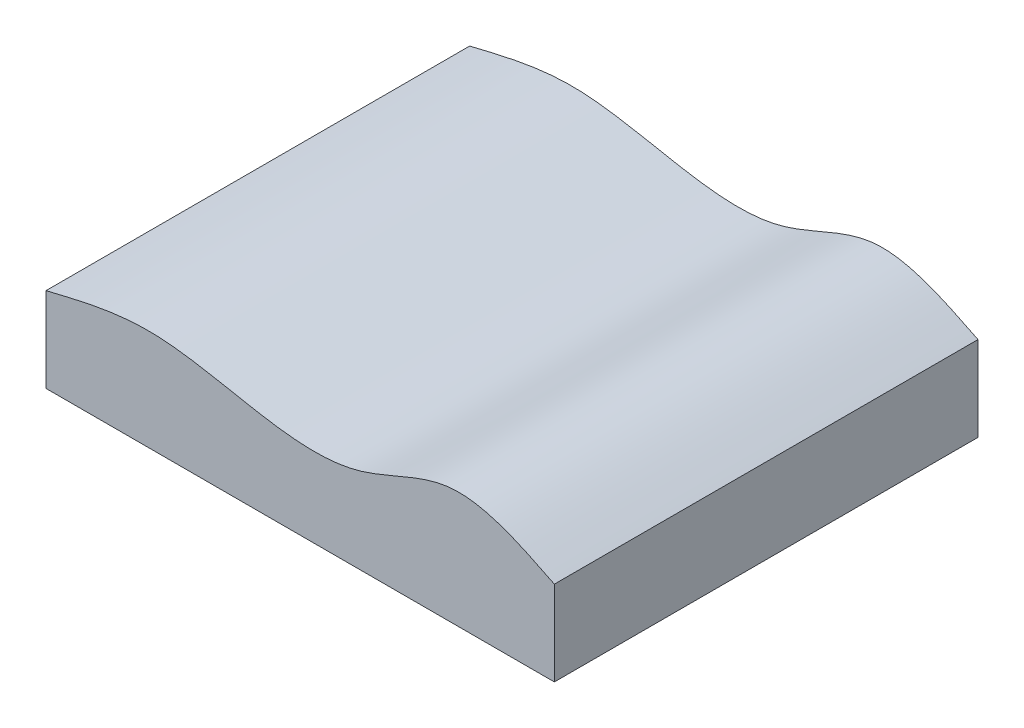
ISO-10303-21;
HEADER;
FILE_DESCRIPTION(('STEP AP214'),'2;1');
FILE_NAME('part.step','',(''),(''),'','','');
FILE_SCHEMA(('AUTOMOTIVE_DESIGN { 1 0 10303 214 1 1 1 1 }'));
ENDSEC;
DATA;
#1=APPLICATION_CONTEXT('core data for automotive mechanical design processes');
#2=APPLICATION_PROTOCOL_DEFINITION('international standard','automotive_design',2000,#1);
#3=PRODUCT_CONTEXT('',#1,'mechanical');
#4=PRODUCT('Part','Part','',(#3));
#5=PRODUCT_RELATED_PRODUCT_CATEGORY('part','',(#4));
#6=PRODUCT_DEFINITION_FORMATION('','',#4);
#7=PRODUCT_DEFINITION_CONTEXT('part definition',#1,'design');
#8=PRODUCT_DEFINITION('design','',#6,#7);
#9=PRODUCT_DEFINITION_SHAPE('','',#8);
#10=(LENGTH_UNIT() NAMED_UNIT(*) SI_UNIT(.MILLI.,.METRE.));
#11=(NAMED_UNIT(*) PLANE_ANGLE_UNIT() SI_UNIT($,.RADIAN.));
#12=(NAMED_UNIT(*) SI_UNIT($,.STERADIAN.) SOLID_ANGLE_UNIT());
#13=UNCERTAINTY_MEASURE_WITH_UNIT(LENGTH_MEASURE(1.E-05),#10,'distance_accuracy_value','');
#14=(GEOMETRIC_REPRESENTATION_CONTEXT(3) GLOBAL_UNCERTAINTY_ASSIGNED_CONTEXT((#13)) GLOBAL_UNIT_ASSIGNED_CONTEXT((#10,
#11,#12)) REPRESENTATION_CONTEXT('',''));
#15=CARTESIAN_POINT('',(0.,0.,0.));
#16=DIRECTION('',(0.,0.,1.));
#17=DIRECTION('',(1.,0.,0.));
#18=AXIS2_PLACEMENT_3D('',#15,#16,#17);
#19=CARTESIAN_POINT('',(0.,0.,127.));
#20=DIRECTION('',(1.,0.,0.));
#21=DIRECTION('',(0.,0.,-1.));
#22=AXIS2_PLACEMENT_3D('',#19,#20,#21);
#23=PLANE('',#22);
#24=DIRECTION('',(0.,-1.,0.));
#25=VECTOR('',#24,1.);
#26=CARTESIAN_POINT('',(0.,0.,0.));
#27=LINE('',#26,#25);
#28=CARTESIAN_POINT('',(0.,25.4,0.));
#29=VERTEX_POINT('',#28);
#30=CARTESIAN_POINT('',(0.,0.,0.));
#31=VERTEX_POINT('',#30);
#32=EDGE_CURVE('E102',#29,#31,#27,.T.);
#33=ORIENTED_EDGE('',*,*,#32,.T.);
#34=DIRECTION('',(0.,0.,-1.));
#35=VECTOR('',#34,1.);
#36=CARTESIAN_POINT('',(0.,0.,127.));
#37=LINE('',#36,#35);
#38=CARTESIAN_POINT('',(0.,0.,127.));
#39=VERTEX_POINT('',#38);
#40=EDGE_CURVE('E11',#39,#31,#37,.T.);
#41=ORIENTED_EDGE('',*,*,#40,.F.);
#42=DIRECTION('',(0.,-1.,0.));
#43=VECTOR('',#42,1.);
#44=CARTESIAN_POINT('',(0.,0.,127.));
#45=LINE('',#44,#43);
#46=CARTESIAN_POINT('',(0.,25.4,127.));
#47=VERTEX_POINT('',#46);
#48=EDGE_CURVE('E87',#47,#39,#45,.T.);
#49=ORIENTED_EDGE('',*,*,#48,.F.);
#50=DIRECTION('',(0.,0.,-1.));
#51=VECTOR('',#50,1.);
#52=CARTESIAN_POINT('',(0.,25.4,127.));
#53=LINE('',#52,#51);
#54=EDGE_CURVE('E95',#47,#29,#53,.T.);
#55=ORIENTED_EDGE('',*,*,#54,.T.);
#56=EDGE_LOOP('',(#33,#41,#49,#55));
#57=FACE_BOUND('',#56,.T.);
#58=ADVANCED_FACE('F36',(#57),#23,.F.);
#59=CARTESIAN_POINT('',(0.,0.,127.));
#60=DIRECTION('',(0.,1.,0.));
#61=DIRECTION('',(0.,0.,1.));
#62=AXIS2_PLACEMENT_3D('',#59,#60,#61);
#63=PLANE('',#62);
#64=DIRECTION('',(1.,0.,0.));
#65=VECTOR('',#64,1.);
#66=CARTESIAN_POINT('',(0.,0.,0.));
#67=LINE('',#66,#65);
#68=CARTESIAN_POINT('',(152.4,0.,0.));
#69=VERTEX_POINT('',#68);
#70=EDGE_CURVE('E91',#31,#69,#67,.T.);
#71=ORIENTED_EDGE('',*,*,#70,.T.);
#72=DIRECTION('',(0.,0.,-1.));
#73=VECTOR('',#72,1.);
#74=CARTESIAN_POINT('',(152.4,0.,127.));
#75=LINE('',#74,#73);
#76=CARTESIAN_POINT('',(152.4,0.,127.));
#77=VERTEX_POINT('',#76);
#78=EDGE_CURVE('E44',#77,#69,#75,.T.);
#79=ORIENTED_EDGE('',*,*,#78,.F.);
#80=DIRECTION('',(1.,0.,0.));
#81=VECTOR('',#80,1.);
#82=CARTESIAN_POINT('',(0.,0.,127.));
#83=LINE('',#82,#81);
#84=EDGE_CURVE('E82',#39,#77,#83,.T.);
#85=ORIENTED_EDGE('',*,*,#84,.F.);
#86=ORIENTED_EDGE('',*,*,#40,.T.);
#87=EDGE_LOOP('',(#71,#79,#85,#86));
#88=FACE_BOUND('',#87,.T.);
#89=ADVANCED_FACE('F90',(#88),#63,.F.);
#90=CARTESIAN_POINT('',(152.4,0.,127.));
#91=DIRECTION('',(-1.,0.,0.));
#92=DIRECTION('',(0.,0.,1.));
#93=AXIS2_PLACEMENT_3D('',#90,#91,#92);
#94=PLANE('',#93);
#95=DIRECTION('',(0.,1.,0.));
#96=VECTOR('',#95,1.);
#97=CARTESIAN_POINT('',(152.4,0.,0.));
#98=LINE('',#97,#96);
#99=CARTESIAN_POINT('',(152.4,25.4,0.));
#100=VERTEX_POINT('',#99);
#101=EDGE_CURVE('E69',#69,#100,#98,.T.);
#102=ORIENTED_EDGE('',*,*,#101,.T.);
#103=DIRECTION('',(0.,0.,-1.));
#104=VECTOR('',#103,1.);
#105=CARTESIAN_POINT('',(152.4,25.4,127.));
#106=LINE('',#105,#104);
#107=CARTESIAN_POINT('',(152.4,25.4,127.));
#108=VERTEX_POINT('',#107);
#109=EDGE_CURVE('E92',#108,#100,#106,.T.);
#110=ORIENTED_EDGE('',*,*,#109,.F.);
#111=DIRECTION('',(0.,1.,0.));
#112=VECTOR('',#111,1.);
#113=CARTESIAN_POINT('',(152.4,0.,127.));
#114=LINE('',#113,#112);
#115=EDGE_CURVE('E85',#77,#108,#114,.T.);
#116=ORIENTED_EDGE('',*,*,#115,.F.);
#117=ORIENTED_EDGE('',*,*,#78,.T.);
#118=EDGE_LOOP('',(#102,#110,#116,#117));
#119=FACE_BOUND('',#118,.T.);
#120=ADVANCED_FACE('F93',(#119),#94,.F.);
#121=CARTESIAN_POINT('',(152.4,25.4,127.));
#122=CARTESIAN_POINT('',(141.906968779777,30.6171690976106,127.));
#123=CARTESIAN_POINT('',(121.976480482095,40.5266724112536,127.));
#124=CARTESIAN_POINT('',(83.1578212254604,15.1733128021704,127.));
#125=CARTESIAN_POINT('',(40.8560652862028,35.3808093712694,127.));
#126=CARTESIAN_POINT('',(10.1408265817838,27.877322675859,127.));
#127=CARTESIAN_POINT('',(0.,25.4,127.));
#128=B_SPLINE_CURVE_WITH_KNOTS('',3,(#121,#122,#123,#124,#125,#126,#127),.UNSPECIFIED.,.F.,.F.,
(4,1,1,1,4),(0.,0.20962993157164,0.398171587441797,0.80130261651312,1.),.UNSPECIFIED.);
#129=DIRECTION('',(0.,0.,-1.));
#130=VECTOR('',#129,1.);
#131=SURFACE_OF_LINEAR_EXTRUSION('',#128,#130);
#132=CARTESIAN_POINT('',(152.4,25.4,0.));
#133=CARTESIAN_POINT('',(141.906968779777,30.6171690976106,0.));
#134=CARTESIAN_POINT('',(121.976480482095,40.5266724112536,0.));
#135=CARTESIAN_POINT('',(83.1578212254604,15.1733128021704,0.));
#136=CARTESIAN_POINT('',(40.8560652862028,35.3808093712694,0.));
#137=CARTESIAN_POINT('',(10.1408265817838,27.877322675859,0.));
#138=CARTESIAN_POINT('',(0.,25.4,0.));
#139=B_SPLINE_CURVE_WITH_KNOTS('',3,(#132,#133,#134,#135,#136,#137,#138),.UNSPECIFIED.,.F.,.F.,
(4,1,1,1,4),(0.,0.20962993157164,0.398171587441797,0.80130261651312,1.),.UNSPECIFIED.);
#140=EDGE_CURVE('E75',#100,#29,#139,.T.);
#141=ORIENTED_EDGE('',*,*,#140,.T.);
#142=ORIENTED_EDGE('',*,*,#54,.F.);
#143=EDGE_CURVE('E52',#108,#47,#128,.T.);
#144=ORIENTED_EDGE('',*,*,#143,.F.);
#145=ORIENTED_EDGE('',*,*,#109,.T.);
#146=EDGE_LOOP('',(#141,#142,#144,#145));
#147=FACE_BOUND('',#146,.T.);
#148=ADVANCED_FACE('F108',(#147),#131,.F.);
#149=CARTESIAN_POINT('',(77.7215339926705,23.8921648588265,127.));
#150=DIRECTION('',(0.,0.,-1.));
#151=DIRECTION('',(-1.,0.,0.));
#152=AXIS2_PLACEMENT_3D('',#149,#150,#151);
#153=PLANE('',#152);
#154=ORIENTED_EDGE('',*,*,#48,.T.);
#155=ORIENTED_EDGE('',*,*,#84,.T.);
#156=ORIENTED_EDGE('',*,*,#115,.T.);
#157=ORIENTED_EDGE('',*,*,#143,.T.);
#158=EDGE_LOOP('',(#154,#155,#156,#157));
#159=FACE_BOUND('',#158,.T.);
#160=ADVANCED_FACE('F83',(#159),#153,.F.);
#161=CARTESIAN_POINT('',(77.7215339926705,23.8921648588265,0.));
#162=DIRECTION('',(0.,0.,-1.));
#163=DIRECTION('',(-1.,0.,0.));
#164=AXIS2_PLACEMENT_3D('',#161,#162,#163);
#165=PLANE('',#164);
#166=ORIENTED_EDGE('',*,*,#32,.F.);
#167=ORIENTED_EDGE('',*,*,#140,.F.);
#168=ORIENTED_EDGE('',*,*,#101,.F.);
#169=ORIENTED_EDGE('',*,*,#70,.F.);
#170=EDGE_LOOP('',(#166,#167,#168,#169));
#171=FACE_BOUND('',#170,.T.);
#172=ADVANCED_FACE('F112',(#171),#165,.T.);
#173=CLOSED_SHELL('',(#58,#89,#120,#148,#160,#172));
#174=MANIFOLD_SOLID_BREP('B2',#173);
#175=ADVANCED_BREP_SHAPE_REPRESENTATION('',(#18,#174),#14);
#176=SHAPE_DEFINITION_REPRESENTATION(#9,#175);
ENDSEC;
END-ISO-10303-21;
